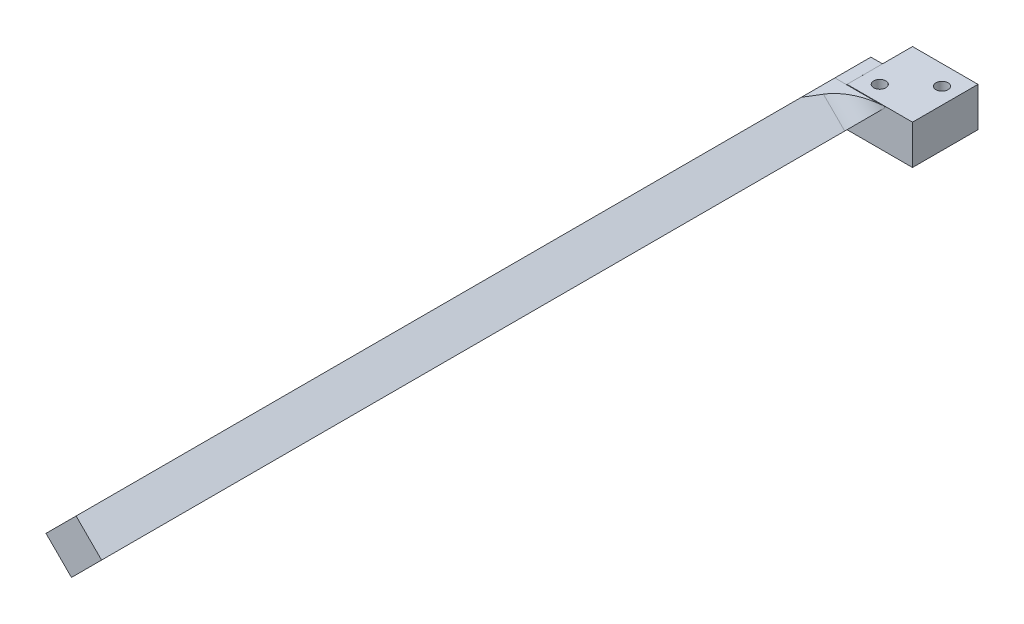
ISO-10303-21;
HEADER;
FILE_DESCRIPTION(('STEP AP214'),'2;1');
FILE_NAME('part.step','',(''),(''),'','','');
FILE_SCHEMA(('AUTOMOTIVE_DESIGN { 1 0 10303 214 1 1 1 1 }'));
ENDSEC;
DATA;
#1=APPLICATION_CONTEXT('core data for automotive mechanical design processes');
#2=APPLICATION_PROTOCOL_DEFINITION('international standard','automotive_design',2000,#1);
#3=PRODUCT_CONTEXT('',#1,'mechanical');
#4=PRODUCT('Part','Part','',(#3));
#5=PRODUCT_RELATED_PRODUCT_CATEGORY('part','',(#4));
#6=PRODUCT_DEFINITION_FORMATION('','',#4);
#7=PRODUCT_DEFINITION_CONTEXT('part definition',#1,'design');
#8=PRODUCT_DEFINITION('design','',#6,#7);
#9=PRODUCT_DEFINITION_SHAPE('','',#8);
#10=(LENGTH_UNIT() NAMED_UNIT(*) SI_UNIT(.MILLI.,.METRE.));
#11=(NAMED_UNIT(*) PLANE_ANGLE_UNIT() SI_UNIT($,.RADIAN.));
#12=(NAMED_UNIT(*) SI_UNIT($,.STERADIAN.) SOLID_ANGLE_UNIT());
#13=UNCERTAINTY_MEASURE_WITH_UNIT(LENGTH_MEASURE(1.E-05),#10,'distance_accuracy_value','');
#14=(GEOMETRIC_REPRESENTATION_CONTEXT(3) GLOBAL_UNCERTAINTY_ASSIGNED_CONTEXT((#13)) GLOBAL_UNIT_ASSIGNED_CONTEXT((#10,
#11,#12)) REPRESENTATION_CONTEXT('',''));
#15=CARTESIAN_POINT('',(0.,0.,0.));
#16=DIRECTION('',(0.,0.,1.));
#17=DIRECTION('',(1.,0.,0.));
#18=AXIS2_PLACEMENT_3D('',#15,#16,#17);
#19=CARTESIAN_POINT('',(-54.8596687094186,-214.742435052336,20.1546564528659));
#20=DIRECTION('',(0.,0.,1.));
#21=DIRECTION('',(1.,0.,0.));
#22=AXIS2_PLACEMENT_3D('',#19,#20,#21);
#23=PLANE('',#22);
#24=DIRECTION('',(-0.707106781186552,-0.707106781186543,0.));
#25=VECTOR('',#24,1.);
#26=CARTESIAN_POINT('',(-54.8596687094186,-214.742435052336,20.1546564528659));
#27=LINE('',#26,#25);
#28=CARTESIAN_POINT('',(-50.6370361956894,-210.519802538606,20.1546564528659));
#29=VERTEX_POINT('',#28);
#30=CARTESIAN_POINT('',(-50.6371361956895,-210.519902538606,20.1546564528659));
#31=VERTEX_POINT('',#30);
#32=EDGE_CURVE('E197',#29,#31,#27,.T.);
#33=ORIENTED_EDGE('',*,*,#32,.F.);
#34=DIRECTION('',(-1.,0.,0.));
#35=VECTOR('',#34,1.);
#36=CARTESIAN_POINT('',(0.,-210.519802538607,20.1546564528659));
#37=LINE('',#36,#35);
#38=CARTESIAN_POINT('',(-35.0806870095853,-210.519802538607,20.1546763952996));
#39=VERTEX_POINT('',#38);
#40=EDGE_CURVE('E65',#39,#29,#37,.T.);
#41=ORIENTED_EDGE('',*,*,#40,.F.);
#42=DIRECTION('',(-0.707106781186552,-0.707106781186543,0.));
#43=VECTOR('',#42,1.);
#44=CARTESIAN_POINT('',(-47.0814941163666,-222.520609645388,20.1546564528659));
#45=LINE('',#44,#43);
#46=CARTESIAN_POINT('',(-47.0814941163666,-222.520609645388,20.1546564528659));
#47=VERTEX_POINT('',#46);
#48=EDGE_CURVE('E51',#39,#47,#45,.T.);
#49=ORIENTED_EDGE('',*,*,#48,.T.);
#50=DIRECTION('',(0.707106781186544,-0.707106781186551,0.));
#51=VECTOR('',#50,1.);
#52=CARTESIAN_POINT('',(-54.8596687094186,-214.742435052336,20.1546564528659));
#53=LINE('',#52,#51);
#54=CARTESIAN_POINT('',(-47.0817870095854,-222.520316752169,20.1546564528659));
#55=VERTEX_POINT('',#54);
#56=EDGE_CURVE('E57',#55,#47,#53,.T.);
#57=ORIENTED_EDGE('',*,*,#56,.F.);
#58=DIRECTION('',(0.,-1.,0.));
#59=VECTOR('',#58,1.);
#60=CARTESIAN_POINT('',(-47.0817870095854,-210.519902538607,20.1546564528659));
#61=LINE('',#60,#59);
#62=CARTESIAN_POINT('',(-47.0817870095854,-210.519902538607,20.1546564528659));
#63=VERTEX_POINT('',#62);
#64=EDGE_CURVE('E218',#63,#55,#61,.T.);
#65=ORIENTED_EDGE('',*,*,#64,.F.);
#66=DIRECTION('',(1.,0.,0.));
#67=VECTOR('',#66,1.);
#68=CARTESIAN_POINT('',(-50.6371361956895,-210.519902538606,20.1546564528659));
#69=LINE('',#68,#67);
#70=EDGE_CURVE('E194',#31,#63,#69,.T.);
#71=ORIENTED_EDGE('',*,*,#70,.F.);
#72=EDGE_LOOP('',(#33,#41,#49,#57,#65,#71));
#73=FACE_BOUND('',#72,.T.);
#74=ADVANCED_FACE('F47',(#73),#23,.F.);
#75=CARTESIAN_POINT('',(-54.8596687094186,-214.742435052336,14.1546564528659));
#76=DIRECTION('',(-0.707106781186551,-0.707106781186544,0.));
#77=DIRECTION('',(0.707106781186544,-0.707106781186551,0.));
#78=AXIS2_PLACEMENT_3D('',#75,#76,#77);
#79=PLANE('',#78);
#80=DIRECTION('',(0.,0.,1.));
#81=VECTOR('',#80,1.);
#82=CARTESIAN_POINT('',(-47.0817870095854,-222.520316752169,9.15465645286589));
#83=LINE('',#82,#81);
#84=CARTESIAN_POINT('',(-47.0817870095854,-222.520316752169,14.1546564528658));
#85=VERTEX_POINT('',#84);
#86=EDGE_CURVE('E152',#85,#55,#83,.T.);
#87=ORIENTED_EDGE('',*,*,#86,.T.);
#88=ORIENTED_EDGE('',*,*,#56,.T.);
#89=DIRECTION('',(0.,0.,-1.));
#90=VECTOR('',#89,1.);
#91=CARTESIAN_POINT('',(-47.0814941163666,-222.520609645388,14.1546564528659));
#92=LINE('',#91,#90);
#93=CARTESIAN_POINT('',(-47.0814941163666,-222.520609645388,14.1546564528659));
#94=VERTEX_POINT('',#93);
#95=EDGE_CURVE('E138',#47,#94,#92,.T.);
#96=ORIENTED_EDGE('',*,*,#95,.T.);
#97=DIRECTION('',(0.707106781186544,-0.707106781186551,0.));
#98=VECTOR('',#97,1.);
#99=CARTESIAN_POINT('',(-54.8596687094186,-214.742435052336,14.1546564528659));
#100=LINE('',#99,#98);
#101=EDGE_CURVE('E136',#85,#94,#100,.T.);
#102=ORIENTED_EDGE('',*,*,#101,.F.);
#103=EDGE_LOOP('',(#87,#88,#96,#102));
#104=FACE_BOUND('',#103,.T.);
#105=ADVANCED_FACE('F150',(#104),#79,.F.);
#106=CARTESIAN_POINT('',(-49.3530746918805,-209.235841034798,26.207658618796));
#107=DIRECTION('',(-0.64901526361989,-0.649015263619883,-0.396936235656079));
#108=DIRECTION('',(0.707106781186544,-0.707106781186551,0.));
#109=AXIS2_PLACEMENT_3D('',#106,#107,#108);
#110=PLANE('',#109);
#111=DIRECTION('',(0.707106781186544,-0.707106781186551,0.));
#112=VECTOR('',#111,1.);
#113=CARTESIAN_POINT('',(-49.3530746918806,-209.235841034798,26.207658618796));
#114=LINE('',#113,#112);
#115=CARTESIAN_POINT('',(-48.0691131880717,-210.519802538607,26.207658618796));
#116=VERTEX_POINT('',#115);
#117=CARTESIAN_POINT('',(-41.5749000988286,-217.01401562785,26.207658618796));
#118=VERTEX_POINT('',#117);
#119=EDGE_CURVE('E12',#116,#118,#114,.T.);
#120=ORIENTED_EDGE('',*,*,#119,.F.);
#121=DIRECTION('',(-0.521752205818372,0.,0.853097084582794));
#122=VECTOR('',#121,1.);
#123=CARTESIAN_POINT('',(-48.4186400761628,-210.519802538607,26.7791566707231));
#124=LINE('',#123,#122);
#125=CARTESIAN_POINT('',(-50.6370361956893,-210.519802538606,30.4063713540794));
#126=VERTEX_POINT('',#125);
#127=EDGE_CURVE('E190',#116,#126,#124,.T.);
#128=ORIENTED_EDGE('',*,*,#127,.T.);
#129=DIRECTION('',(0.280676303931076,0.280676303931073,-0.917846187998393));
#130=VECTOR('',#129,1.);
#131=CARTESIAN_POINT('',(-49.3530746918805,-209.235841034798,26.207658618796));
#132=LINE('',#131,#130);
#133=CARTESIAN_POINT('',(-102.498571909427,-262.381338252343,200.));
#134=VERTEX_POINT('',#133);
#135=EDGE_CURVE('E105',#134,#126,#132,.T.);
#136=ORIENTED_EDGE('',*,*,#135,.F.);
#137=DIRECTION('',(0.707106781186544,-0.707106781186551,0.));
#138=VECTOR('',#137,1.);
#139=CARTESIAN_POINT('',(-102.498571909427,-262.381338252343,200.));
#140=LINE('',#139,#138);
#141=CARTESIAN_POINT('',(-94.7203973163749,-270.159512845396,200.));
#142=VERTEX_POINT('',#141);
#143=EDGE_CURVE('E98',#134,#142,#140,.T.);
#144=ORIENTED_EDGE('',*,*,#143,.T.);
#145=DIRECTION('',(0.280676303931076,0.280676303931073,-0.917846187998393));
#146=VECTOR('',#145,1.);
#147=CARTESIAN_POINT('',(-41.5749000988286,-217.01401562785,26.207658618796));
#148=LINE('',#147,#146);
#149=EDGE_CURVE('E111',#142,#118,#148,.T.);
#150=ORIENTED_EDGE('',*,*,#149,.T.);
#151=EDGE_LOOP('',(#120,#128,#136,#144,#150));
#152=FACE_BOUND('',#151,.T.);
#153=ADVANCED_FACE('F49',(#152),#110,.F.);
#154=CARTESIAN_POINT('',(-42.8388534292472,-202.721619772164,30.1917412916726));
#155=DIRECTION('',(0.707106781186544,-0.707106781186551,0.));
#156=DIRECTION('',(0.707106781186551,0.707106781186544,0.));
#157=AXIS2_PLACEMENT_3D('',#154,#155,#156);
#158=CYLINDRICAL_SURFACE('',#157,10.0370848388067);
#159=CARTESIAN_POINT('',(-35.0606788361953,-210.499794365216,30.1917412916726));
#160=DIRECTION('',(0.707106781186544,-0.707106781186551,0.));
#161=DIRECTION('',(-0.707106781186551,-0.707106781186544,0.));
#162=AXIS2_PLACEMENT_3D('',#159,#160,#161);
#163=CIRCLE('',#162,10.0370848388067);
#164=EDGE_CURVE('E118',#118,#39,#163,.T.);
#165=ORIENTED_EDGE('',*,*,#164,.T.);
#166=CARTESIAN_POINT('',(-35.0406706628052,-210.519802538607,30.1917412916726));
#167=DIRECTION('',(0.,-1.,0.));
#168=DIRECTION('',(1.,0.,0.));
#169=AXIS2_PLACEMENT_3D('',#166,#167,#168);
#170=ELLIPSE('',#169,14.1945815057297,10.0370848388067);
#171=EDGE_CURVE('E192',#39,#116,#170,.F.);
#172=ORIENTED_EDGE('',*,*,#171,.T.);
#173=ORIENTED_EDGE('',*,*,#119,.T.);
#174=EDGE_LOOP('',(#165,#172,#173));
#175=FACE_BOUND('',#174,.T.);
#176=ADVANCED_FACE('F237',(#175),#158,.F.);
#177=CARTESIAN_POINT('',(-111.690960064852,-271.573726407769,200.));
#178=DIRECTION('',(0.64901526361989,0.649015263619883,0.396936235656079));
#179=DIRECTION('',(-0.707106781186544,0.707106781186551,0.));
#180=AXIS2_PLACEMENT_3D('',#177,#178,#179);
#181=PLANE('',#180);
#182=DIRECTION('',(-0.280676303931076,-0.280676303931073,0.917846187998393));
#183=VECTOR('',#182,1.);
#184=CARTESIAN_POINT('',(-103.9127854718,-279.351901000821,200.));
#185=LINE('',#184,#183);
#186=CARTESIAN_POINT('',(-103.9127854718,-279.351901000821,200.));
#187=VERTEX_POINT('',#186);
#188=EDGE_CURVE('E106',#94,#187,#185,.T.);
#189=ORIENTED_EDGE('',*,*,#188,.T.);
#190=DIRECTION('',(0.707106781186544,-0.707106781186551,0.));
#191=VECTOR('',#190,1.);
#192=CARTESIAN_POINT('',(-111.690960064852,-271.573726407769,200.));
#193=LINE('',#192,#191);
#194=CARTESIAN_POINT('',(-111.690960064852,-271.573726407769,200.));
#195=VERTEX_POINT('',#194);
#196=EDGE_CURVE('E101',#195,#187,#193,.T.);
#197=ORIENTED_EDGE('',*,*,#196,.F.);
#198=DIRECTION('',(-0.280676303931076,-0.280676303931073,0.917846187998393));
#199=VECTOR('',#198,1.);
#200=CARTESIAN_POINT('',(-111.690960064852,-271.573726407769,200.));
#201=LINE('',#200,#199);
#202=CARTESIAN_POINT('',(-54.8596687094186,-214.742435052336,14.1546564528659));
#203=VERTEX_POINT('',#202);
#204=EDGE_CURVE('E199',#203,#195,#201,.T.);
#205=ORIENTED_EDGE('',*,*,#204,.F.);
#206=EDGE_CURVE('E133',#203,#85,#100,.T.);
#207=ORIENTED_EDGE('',*,*,#206,.T.);
#208=ORIENTED_EDGE('',*,*,#101,.T.);
#209=EDGE_LOOP('',(#189,#197,#205,#207,#208));
#210=FACE_BOUND('',#209,.T.);
#211=ADVANCED_FACE('F154',(#210),#181,.F.);
#212=CARTESIAN_POINT('',(-102.498571909427,-262.381338252343,200.));
#213=DIRECTION('',(0.,0.,-1.));
#214=DIRECTION('',(-1.,0.,0.));
#215=AXIS2_PLACEMENT_3D('',#212,#213,#214);
#216=PLANE('',#215);
#217=DIRECTION('',(0.70710678118655,0.707106781186545,0.));
#218=VECTOR('',#217,1.);
#219=CARTESIAN_POINT('',(-94.7203973163749,-270.159512845396,200.));
#220=LINE('',#219,#218);
#221=EDGE_CURVE('E95',#187,#142,#220,.T.);
#222=ORIENTED_EDGE('',*,*,#221,.T.);
#223=ORIENTED_EDGE('',*,*,#143,.F.);
#224=DIRECTION('',(0.70710678118655,0.707106781186545,0.));
#225=VECTOR('',#224,1.);
#226=CARTESIAN_POINT('',(-102.498571909427,-262.381338252343,200.));
#227=LINE('',#226,#225);
#228=EDGE_CURVE('E74',#195,#134,#227,.T.);
#229=ORIENTED_EDGE('',*,*,#228,.F.);
#230=ORIENTED_EDGE('',*,*,#196,.T.);
#231=EDGE_LOOP('',(#222,#223,#229,#230));
#232=FACE_BOUND('',#231,.T.);
#233=ADVANCED_FACE('F97',(#232),#216,.F.);
#234=CARTESIAN_POINT('',(-42.8388534292472,-202.721619772164,30.1917412916726));
#235=DIRECTION('',(-0.707106781186544,0.707106781186551,0.));
#236=DIRECTION('',(-0.707106781186551,-0.707106781186544,0.));
#237=AXIS2_PLACEMENT_3D('',#234,#235,#236);
#238=PLANE('',#237);
#239=DIRECTION('',(0.,0.,-1.));
#240=VECTOR('',#239,1.);
#241=CARTESIAN_POINT('',(-50.6370361956893,-210.519802538606,31.1546564528659));
#242=LINE('',#241,#240);
#243=EDGE_CURVE('E188',#126,#29,#242,.T.);
#244=ORIENTED_EDGE('',*,*,#243,.T.);
#245=ORIENTED_EDGE('',*,*,#32,.T.);
#246=DIRECTION('',(0.,0.,1.));
#247=VECTOR('',#246,1.);
#248=CARTESIAN_POINT('',(-50.6371361956895,-210.519902538606,9.15465645286589));
#249=LINE('',#248,#247);
#250=CARTESIAN_POINT('',(-50.6371361956895,-210.519902538606,9.15465645286589));
#251=VERTEX_POINT('',#250);
#252=EDGE_CURVE('E119',#251,#31,#249,.T.);
#253=ORIENTED_EDGE('',*,*,#252,.F.);
#254=DIRECTION('',(0.707106781186548,0.707106781186547,0.));
#255=VECTOR('',#254,1.);
#256=CARTESIAN_POINT('',(-54.8596687094186,-214.742435052336,9.15465645286589));
#257=LINE('',#256,#255);
#258=CARTESIAN_POINT('',(-54.8596687094186,-214.742435052336,9.15465645286589));
#259=VERTEX_POINT('',#258);
#260=EDGE_CURVE('E208',#259,#251,#257,.T.);
#261=ORIENTED_EDGE('',*,*,#260,.F.);
#262=DIRECTION('',(0.,0.,1.));
#263=VECTOR('',#262,1.);
#264=CARTESIAN_POINT('',(-54.8596687094186,-214.742435052336,9.15465645286589));
#265=LINE('',#264,#263);
#266=EDGE_CURVE('E205',#259,#203,#265,.T.);
#267=ORIENTED_EDGE('',*,*,#266,.T.);
#268=ORIENTED_EDGE('',*,*,#204,.T.);
#269=ORIENTED_EDGE('',*,*,#228,.T.);
#270=ORIENTED_EDGE('',*,*,#135,.T.);
#271=EDGE_LOOP('',(#244,#245,#253,#261,#267,#268,#269,#270));
#272=FACE_BOUND('',#271,.T.);
#273=ADVANCED_FACE('F196',(#272),#238,.T.);
#274=CARTESIAN_POINT('',(-35.0606788361953,-210.499794365216,30.1917412916726));
#275=DIRECTION('',(-0.707106781186544,0.707106781186551,0.));
#276=DIRECTION('',(-0.707106781186551,-0.707106781186544,0.));
#277=AXIS2_PLACEMENT_3D('',#274,#275,#276);
#278=PLANE('',#277);
#279=ORIENTED_EDGE('',*,*,#48,.F.);
#280=ORIENTED_EDGE('',*,*,#164,.F.);
#281=ORIENTED_EDGE('',*,*,#149,.F.);
#282=ORIENTED_EDGE('',*,*,#221,.F.);
#283=ORIENTED_EDGE('',*,*,#188,.F.);
#284=ORIENTED_EDGE('',*,*,#95,.F.);
#285=EDGE_LOOP('',(#279,#280,#281,#282,#283,#284));
#286=FACE_BOUND('',#285,.T.);
#287=ADVANCED_FACE('F116',(#286),#278,.F.);
#288=CARTESIAN_POINT('',(-47.0817870095854,-222.520316752169,9.15465645286589));
#289=DIRECTION('',(0.707106781186546,0.707106781186549,0.));
#290=DIRECTION('',(-0.707106781186549,0.707106781186546,0.));
#291=AXIS2_PLACEMENT_3D('',#288,#289,#290);
#292=PLANE('',#291);
#293=CARTESIAN_POINT('',(-47.0817870095854,-222.520316752169,9.15465645286589));
#294=VERTEX_POINT('',#293);
#295=EDGE_CURVE('E213',#294,#85,#83,.T.);
#296=ORIENTED_EDGE('',*,*,#295,.T.);
#297=ORIENTED_EDGE('',*,*,#206,.F.);
#298=ORIENTED_EDGE('',*,*,#266,.F.);
#299=DIRECTION('',(-0.707106781186549,0.707106781186546,0.));
#300=VECTOR('',#299,1.);
#301=CARTESIAN_POINT('',(-47.0817870095854,-222.520316752169,9.15465645286589));
#302=LINE('',#301,#300);
#303=EDGE_CURVE('E211',#294,#259,#302,.T.);
#304=ORIENTED_EDGE('',*,*,#303,.F.);
#305=EDGE_LOOP('',(#296,#297,#298,#304));
#306=FACE_BOUND('',#305,.T.);
#307=ADVANCED_FACE('F255',(#306),#292,.F.);
#308=CARTESIAN_POINT('',(-50.6371361956895,-210.519902538606,9.15465645286589));
#309=DIRECTION('',(0.,-1.,0.));
#310=DIRECTION('',(1.,0.,0.));
#311=AXIS2_PLACEMENT_3D('',#308,#309,#310);
#312=PLANE('',#311);
#313=ORIENTED_EDGE('',*,*,#70,.T.);
#314=DIRECTION('',(0.,0.,1.));
#315=VECTOR('',#314,1.);
#316=CARTESIAN_POINT('',(-47.0817870095854,-210.519902538607,9.15465645286589));
#317=LINE('',#316,#315);
#318=CARTESIAN_POINT('',(-47.0817870095854,-210.519902538607,9.15465645286589));
#319=VERTEX_POINT('',#318);
#320=EDGE_CURVE('E122',#319,#63,#317,.T.);
#321=ORIENTED_EDGE('',*,*,#320,.F.);
#322=DIRECTION('',(1.,0.,0.));
#323=VECTOR('',#322,1.);
#324=CARTESIAN_POINT('',(-50.6371361956895,-210.519902538606,9.15465645286589));
#325=LINE('',#324,#323);
#326=EDGE_CURVE('E226',#251,#319,#325,.T.);
#327=ORIENTED_EDGE('',*,*,#326,.F.);
#328=ORIENTED_EDGE('',*,*,#252,.T.);
#329=EDGE_LOOP('',(#313,#321,#327,#328));
#330=FACE_BOUND('',#329,.T.);
#331=ADVANCED_FACE('F258',(#330),#312,.F.);
#332=CARTESIAN_POINT('',(-47.0817870095854,-210.519902538607,9.15465645286589));
#333=DIRECTION('',(-1.,0.,0.));
#334=DIRECTION('',(0.,0.,1.));
#335=AXIS2_PLACEMENT_3D('',#332,#333,#334);
#336=PLANE('',#335);
#337=ORIENTED_EDGE('',*,*,#64,.T.);
#338=ORIENTED_EDGE('',*,*,#86,.F.);
#339=ORIENTED_EDGE('',*,*,#295,.F.);
#340=DIRECTION('',(0.,-1.,0.));
#341=VECTOR('',#340,1.);
#342=CARTESIAN_POINT('',(-47.0817870095854,-210.519902538607,9.15465645286589));
#343=LINE('',#342,#341);
#344=EDGE_CURVE('E215',#319,#294,#343,.T.);
#345=ORIENTED_EDGE('',*,*,#344,.F.);
#346=ORIENTED_EDGE('',*,*,#320,.T.);
#347=EDGE_LOOP('',(#337,#338,#339,#345,#346));
#348=FACE_BOUND('',#347,.T.);
#349=ADVANCED_FACE('F223',(#348),#336,.F.);
#350=CARTESIAN_POINT('',(0.,0.,9.15465645286589));
#351=DIRECTION('',(0.,0.,1.));
#352=DIRECTION('',(1.,0.,0.));
#353=AXIS2_PLACEMENT_3D('',#350,#351,#352);
#354=PLANE('',#353);
#355=ORIENTED_EDGE('',*,*,#260,.T.);
#356=ORIENTED_EDGE('',*,*,#326,.T.);
#357=ORIENTED_EDGE('',*,*,#344,.T.);
#358=ORIENTED_EDGE('',*,*,#303,.T.);
#359=EDGE_LOOP('',(#355,#356,#357,#358));
#360=FACE_BOUND('',#359,.T.);
#361=ADVANCED_FACE('F263',(#360),#354,.F.);
#362=CARTESIAN_POINT('',(0.,-210.519802538607,31.1546564528659));
#363=DIRECTION('',(0.,-1.,0.));
#364=DIRECTION('',(0.,0.,-1.));
#365=AXIS2_PLACEMENT_3D('',#362,#363,#364);
#366=PLANE('',#365);
#367=ORIENTED_EDGE('',*,*,#171,.F.);
#368=ORIENTED_EDGE('',*,*,#40,.T.);
#369=ORIENTED_EDGE('',*,*,#243,.F.);
#370=ORIENTED_EDGE('',*,*,#127,.F.);
#371=EDGE_LOOP('',(#367,#368,#369,#370));
#372=FACE_BOUND('',#371,.T.);
#373=ADVANCED_FACE('F189',(#372),#366,.F.);
#374=CLOSED_SHELL('',(#74,#105,#153,#176,#211,#233,#273,#287,#307,#331,#349,#361,#373));
#375=MANIFOLD_SOLID_BREP('B2',#374);
#376=CARTESIAN_POINT('',(-47.0807870095854,-210.519902538607,20.));
#377=DIRECTION('',(1.,0.,0.));
#378=DIRECTION('',(0.,0.,-1.));
#379=AXIS2_PLACEMENT_3D('',#376,#377,#378);
#380=PLANE('',#379);
#381=CARTESIAN_POINT('',(-47.0807870095854,-216.708306212354,3.71895693201907));
#382=DIRECTION('',(-1.,0.,0.));
#383=DIRECTION('',(0.,0.,1.));
#384=AXIS2_PLACEMENT_3D('',#381,#382,#383);
#385=CIRCLE('',#384,1.38884616299363);
#386=CARTESIAN_POINT('',(-47.0807870095854,-216.708306212354,5.1078030950127));
#387=VERTEX_POINT('',#386);
#388=EDGE_CURVE('E438',#387,#387,#385,.T.);
#389=ORIENTED_EDGE('',*,*,#388,.F.);
#390=EDGE_LOOP('',(#389));
#391=FACE_BOUND('',#390,.T.);
#392=DIRECTION('',(0.,-1.,0.));
#393=VECTOR('',#392,1.);
#394=CARTESIAN_POINT('',(-47.0807870095854,-210.519902538607,0.));
#395=LINE('',#394,#393);
#396=CARTESIAN_POINT('',(-47.0807870095854,-210.519902538607,0.));
#397=VERTEX_POINT('',#396);
#398=CARTESIAN_POINT('',(-47.0807870095854,-222.519902538607,0.));
#399=VERTEX_POINT('',#398);
#400=EDGE_CURVE('E416',#397,#399,#395,.T.);
#401=ORIENTED_EDGE('',*,*,#400,.T.);
#402=DIRECTION('',(0.,0.,-1.));
#403=VECTOR('',#402,1.);
#404=CARTESIAN_POINT('',(-47.0807870095854,-222.519902538607,20.));
#405=LINE('',#404,#403);
#406=CARTESIAN_POINT('',(-47.0807870095854,-222.519902538607,20.));
#407=VERTEX_POINT('',#406);
#408=EDGE_CURVE('E45',#407,#399,#405,.T.);
#409=ORIENTED_EDGE('',*,*,#408,.F.);
#410=DIRECTION('',(0.,-1.,0.));
#411=VECTOR('',#410,1.);
#412=CARTESIAN_POINT('',(-47.0807870095854,-210.519902538607,20.));
#413=LINE('',#412,#411);
#414=CARTESIAN_POINT('',(-47.0807870095854,-210.519902538607,20.));
#415=VERTEX_POINT('',#414);
#416=EDGE_CURVE('E403',#415,#407,#413,.T.);
#417=ORIENTED_EDGE('',*,*,#416,.F.);
#418=DIRECTION('',(0.,0.,-1.));
#419=VECTOR('',#418,1.);
#420=CARTESIAN_POINT('',(-47.0807870095854,-210.519902538607,20.));
#421=LINE('',#420,#419);
#422=EDGE_CURVE('E412',#415,#397,#421,.T.);
#423=ORIENTED_EDGE('',*,*,#422,.T.);
#424=EDGE_LOOP('',(#401,#409,#417,#423));
#425=FACE_BOUND('',#424,.T.);
#426=ADVANCED_FACE('F350',(#391,#425),#380,.F.);
#427=CARTESIAN_POINT('',(-47.0807870095854,-222.519902538607,20.));
#428=DIRECTION('',(0.,1.,0.));
#429=DIRECTION('',(0.,0.,1.));
#430=AXIS2_PLACEMENT_3D('',#427,#428,#429);
#431=PLANE('',#430);
#432=CARTESIAN_POINT('',(-42.0807870095854,-222.519902538607,15.));
#433=DIRECTION('',(0.,-1.,0.));
#434=DIRECTION('',(0.,0.,-1.));
#435=AXIS2_PLACEMENT_3D('',#432,#433,#434);
#436=CIRCLE('',#435,1.85);
#437=CARTESIAN_POINT('',(-42.0807870095854,-222.519902538607,13.15));
#438=VERTEX_POINT('',#437);
#439=EDGE_CURVE('E425',#438,#438,#436,.T.);
#440=ORIENTED_EDGE('',*,*,#439,.F.);
#441=EDGE_LOOP('',(#440));
#442=FACE_BOUND('',#441,.T.);
#443=CARTESIAN_POINT('',(-32.0807870095854,-222.519902538607,6.00000000000001));
#444=DIRECTION('',(0.,-1.,0.));
#445=DIRECTION('',(0.,0.,-1.));
#446=AXIS2_PLACEMENT_3D('',#443,#444,#445);
#447=CIRCLE('',#446,1.85);
#448=CARTESIAN_POINT('',(-32.0807870095854,-222.519902538607,4.15000000000001));
#449=VERTEX_POINT('',#448);
#450=EDGE_CURVE('E430',#449,#449,#447,.T.);
#451=ORIENTED_EDGE('',*,*,#450,.F.);
#452=EDGE_LOOP('',(#451));
#453=FACE_BOUND('',#452,.T.);
#454=DIRECTION('',(1.,0.,0.));
#455=VECTOR('',#454,1.);
#456=CARTESIAN_POINT('',(-47.0807870095854,-222.519902538607,0.));
#457=LINE('',#456,#455);
#458=CARTESIAN_POINT('',(-27.0807870095854,-222.519902538607,0.));
#459=VERTEX_POINT('',#458);
#460=EDGE_CURVE('E407',#399,#459,#457,.T.);
#461=ORIENTED_EDGE('',*,*,#460,.T.);
#462=DIRECTION('',(0.,0.,-1.));
#463=VECTOR('',#462,1.);
#464=CARTESIAN_POINT('',(-27.0807870095854,-222.519902538607,20.));
#465=LINE('',#464,#463);
#466=CARTESIAN_POINT('',(-27.0807870095854,-222.519902538607,20.));
#467=VERTEX_POINT('',#466);
#468=EDGE_CURVE('E359',#467,#459,#465,.T.);
#469=ORIENTED_EDGE('',*,*,#468,.F.);
#470=DIRECTION('',(1.,0.,0.));
#471=VECTOR('',#470,1.);
#472=CARTESIAN_POINT('',(-47.0807870095854,-222.519902538607,20.));
#473=LINE('',#472,#471);
#474=EDGE_CURVE('E398',#407,#467,#473,.T.);
#475=ORIENTED_EDGE('',*,*,#474,.F.);
#476=ORIENTED_EDGE('',*,*,#408,.T.);
#477=EDGE_LOOP('',(#461,#469,#475,#476));
#478=FACE_BOUND('',#477,.T.);
#479=ADVANCED_FACE('F406',(#442,#453,#478),#431,.F.);
#480=CARTESIAN_POINT('',(-27.0807870095854,-210.519902538607,20.));
#481=DIRECTION('',(-1.,0.,0.));
#482=DIRECTION('',(0.,0.,1.));
#483=AXIS2_PLACEMENT_3D('',#480,#481,#482);
#484=PLANE('',#483);
#485=DIRECTION('',(0.,1.,0.));
#486=VECTOR('',#485,1.);
#487=CARTESIAN_POINT('',(-27.0807870095854,-210.519902538607,0.));
#488=LINE('',#487,#486);
#489=CARTESIAN_POINT('',(-27.0807870095854,-210.519902538607,0.));
#490=VERTEX_POINT('',#489);
#491=EDGE_CURVE('E385',#459,#490,#488,.T.);
#492=ORIENTED_EDGE('',*,*,#491,.T.);
#493=DIRECTION('',(0.,0.,-1.));
#494=VECTOR('',#493,1.);
#495=CARTESIAN_POINT('',(-27.0807870095854,-210.519902538607,20.));
#496=LINE('',#495,#494);
#497=CARTESIAN_POINT('',(-27.0807870095854,-210.519902538607,20.));
#498=VERTEX_POINT('',#497);
#499=EDGE_CURVE('E408',#498,#490,#496,.T.);
#500=ORIENTED_EDGE('',*,*,#499,.F.);
#501=DIRECTION('',(0.,1.,0.));
#502=VECTOR('',#501,1.);
#503=CARTESIAN_POINT('',(-27.0807870095854,-210.519902538607,20.));
#504=LINE('',#503,#502);
#505=EDGE_CURVE('E401',#467,#498,#504,.T.);
#506=ORIENTED_EDGE('',*,*,#505,.F.);
#507=ORIENTED_EDGE('',*,*,#468,.T.);
#508=EDGE_LOOP('',(#492,#500,#506,#507));
#509=FACE_BOUND('',#508,.T.);
#510=ADVANCED_FACE('F410',(#509),#484,.F.);
#511=CARTESIAN_POINT('',(-47.0807870095854,-210.519902538607,20.));
#512=DIRECTION('',(0.,-1.,0.));
#513=DIRECTION('',(0.,0.,-1.));
#514=AXIS2_PLACEMENT_3D('',#511,#512,#513);
#515=PLANE('',#514);
#516=CARTESIAN_POINT('',(-42.0807870095854,-210.519902538607,15.));
#517=DIRECTION('',(0.,-1.,0.));
#518=DIRECTION('',(0.,0.,-1.));
#519=AXIS2_PLACEMENT_3D('',#516,#517,#518);
#520=CIRCLE('',#519,1.85);
#521=CARTESIAN_POINT('',(-42.0807870095854,-210.519902538607,13.15));
#522=VERTEX_POINT('',#521);
#523=EDGE_CURVE('E353',#522,#522,#520,.T.);
#524=ORIENTED_EDGE('',*,*,#523,.T.);
#525=EDGE_LOOP('',(#524));
#526=FACE_BOUND('',#525,.T.);
#527=CARTESIAN_POINT('',(-32.0807870095854,-210.519902538607,6.00000000000001));
#528=DIRECTION('',(0.,-1.,0.));
#529=DIRECTION('',(0.,0.,-1.));
#530=AXIS2_PLACEMENT_3D('',#527,#528,#529);
#531=CIRCLE('',#530,1.85);
#532=CARTESIAN_POINT('',(-32.0807870095854,-210.519902538607,4.15000000000001));
#533=VERTEX_POINT('',#532);
#534=EDGE_CURVE('E423',#533,#533,#531,.T.);
#535=ORIENTED_EDGE('',*,*,#534,.T.);
#536=EDGE_LOOP('',(#535));
#537=FACE_BOUND('',#536,.T.);
#538=DIRECTION('',(-1.,0.,0.));
#539=VECTOR('',#538,1.);
#540=CARTESIAN_POINT('',(-47.0807870095854,-210.519902538607,0.));
#541=LINE('',#540,#539);
#542=EDGE_CURVE('E391',#490,#397,#541,.T.);
#543=ORIENTED_EDGE('',*,*,#542,.T.);
#544=ORIENTED_EDGE('',*,*,#422,.F.);
#545=DIRECTION('',(-1.,0.,0.));
#546=VECTOR('',#545,1.);
#547=CARTESIAN_POINT('',(-47.0807870095854,-210.519902538607,20.));
#548=LINE('',#547,#546);
#549=EDGE_CURVE('E368',#498,#415,#548,.T.);
#550=ORIENTED_EDGE('',*,*,#549,.F.);
#551=ORIENTED_EDGE('',*,*,#499,.T.);
#552=EDGE_LOOP('',(#543,#544,#550,#551));
#553=FACE_BOUND('',#552,.T.);
#554=ADVANCED_FACE('F467',(#526,#537,#553),#515,.F.);
#555=CARTESIAN_POINT('',(0.,0.,20.));
#556=DIRECTION('',(0.,0.,1.));
#557=DIRECTION('',(1.,0.,0.));
#558=AXIS2_PLACEMENT_3D('',#555,#556,#557);
#559=PLANE('',#558);
#560=ORIENTED_EDGE('',*,*,#416,.T.);
#561=ORIENTED_EDGE('',*,*,#474,.T.);
#562=ORIENTED_EDGE('',*,*,#505,.T.);
#563=ORIENTED_EDGE('',*,*,#549,.T.);
#564=EDGE_LOOP('',(#560,#561,#562,#563));
#565=FACE_BOUND('',#564,.T.);
#566=ADVANCED_FACE('F399',(#565),#559,.T.);
#567=CARTESIAN_POINT('',(0.,0.,0.));
#568=DIRECTION('',(0.,0.,1.));
#569=DIRECTION('',(1.,0.,0.));
#570=AXIS2_PLACEMENT_3D('',#567,#568,#569);
#571=PLANE('',#570);
#572=ORIENTED_EDGE('',*,*,#400,.F.);
#573=ORIENTED_EDGE('',*,*,#542,.F.);
#574=ORIENTED_EDGE('',*,*,#491,.F.);
#575=ORIENTED_EDGE('',*,*,#460,.F.);
#576=EDGE_LOOP('',(#572,#573,#574,#575));
#577=FACE_BOUND('',#576,.T.);
#578=ADVANCED_FACE('F457',(#577),#571,.F.);
#579=CARTESIAN_POINT('',(-32.0807870095854,-202.519902538607,6.00000000000001));
#580=DIRECTION('',(0.,-1.,0.));
#581=DIRECTION('',(0.,0.,-1.));
#582=AXIS2_PLACEMENT_3D('',#579,#580,#581);
#583=CYLINDRICAL_SURFACE('',#582,1.85);
#584=ORIENTED_EDGE('',*,*,#450,.T.);
#585=EDGE_LOOP('',(#584));
#586=FACE_BOUND('',#585,.T.);
#587=ORIENTED_EDGE('',*,*,#534,.F.);
#588=EDGE_LOOP('',(#587));
#589=FACE_BOUND('',#588,.T.);
#590=ADVANCED_FACE('F459',(#586,#589),#583,.F.);
#591=CARTESIAN_POINT('',(-42.0807870095854,-202.519902538607,15.));
#592=DIRECTION('',(0.,-1.,0.));
#593=DIRECTION('',(0.,0.,-1.));
#594=AXIS2_PLACEMENT_3D('',#591,#592,#593);
#595=CYLINDRICAL_SURFACE('',#594,1.85);
#596=ORIENTED_EDGE('',*,*,#439,.T.);
#597=EDGE_LOOP('',(#596));
#598=FACE_BOUND('',#597,.T.);
#599=ORIENTED_EDGE('',*,*,#523,.F.);
#600=EDGE_LOOP('',(#599));
#601=FACE_BOUND('',#600,.T.);
#602=ADVANCED_FACE('F449',(#598,#601),#595,.F.);
#603=CARTESIAN_POINT('',(-46.0807870095854,-216.708306212354,3.71895693201907));
#604=DIRECTION('',(-1.,0.,0.));
#605=DIRECTION('',(0.,0.,1.));
#606=AXIS2_PLACEMENT_3D('',#603,#604,#605);
#607=CYLINDRICAL_SURFACE('',#606,1.38884616299363);
#608=CARTESIAN_POINT('',(-46.0807870095854,-216.708306212354,3.71895693201907));
#609=DIRECTION('',(-1.,0.,0.));
#610=DIRECTION('',(0.,0.,1.));
#611=AXIS2_PLACEMENT_3D('',#608,#609,#610);
#612=CIRCLE('',#611,1.38884616299363);
#613=CARTESIAN_POINT('',(-46.0807870095854,-216.708306212354,5.1078030950127));
#614=VERTEX_POINT('',#613);
#615=EDGE_CURVE('E435',#614,#614,#612,.T.);
#616=ORIENTED_EDGE('',*,*,#615,.F.);
#617=EDGE_LOOP('',(#616));
#618=FACE_BOUND('',#617,.T.);
#619=ORIENTED_EDGE('',*,*,#388,.T.);
#620=EDGE_LOOP('',(#619));
#621=FACE_BOUND('',#620,.T.);
#622=ADVANCED_FACE('F446',(#618,#621),#607,.F.);
#623=CARTESIAN_POINT('',(-46.0807870095854,-216.708306212354,3.71895693201907));
#624=DIRECTION('',(-1.,0.,0.));
#625=DIRECTION('',(0.,0.,1.));
#626=AXIS2_PLACEMENT_3D('',#623,#624,#625);
#627=PLANE('',#626);
#628=ORIENTED_EDGE('',*,*,#615,.T.);
#629=EDGE_LOOP('',(#628));
#630=FACE_BOUND('',#629,.T.);
#631=ADVANCED_FACE('F444',(#630),#627,.T.);
#632=CLOSED_SHELL('',(#426,#479,#510,#554,#566,#578,#590,#602,#622,#631));
#633=MANIFOLD_SOLID_BREP('B6',#632);
#634=ADVANCED_BREP_SHAPE_REPRESENTATION('',(#18,#375,#633),#14);
#635=SHAPE_DEFINITION_REPRESENTATION(#9,#634);
ENDSEC;
END-ISO-10303-21;
